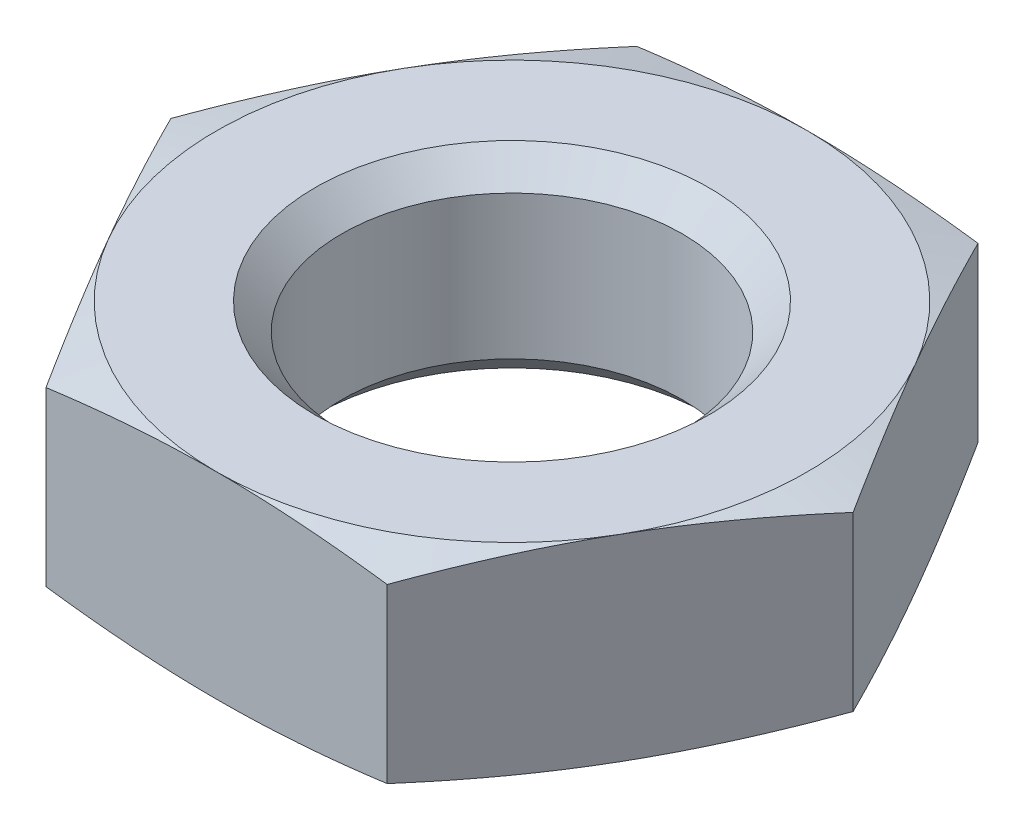
ISO-10303-21;
HEADER;
FILE_DESCRIPTION(('STEP AP214'),'2;1');
FILE_NAME('part.step','',(''),(''),'','','');
FILE_SCHEMA(('AUTOMOTIVE_DESIGN { 1 0 10303 214 1 1 1 1 }'));
ENDSEC;
DATA;
#1=APPLICATION_CONTEXT('core data for automotive mechanical design processes');
#2=APPLICATION_PROTOCOL_DEFINITION('international standard','automotive_design',2000,#1);
#3=PRODUCT_CONTEXT('',#1,'mechanical');
#4=PRODUCT('Part','Part','',(#3));
#5=PRODUCT_RELATED_PRODUCT_CATEGORY('part','',(#4));
#6=PRODUCT_DEFINITION_FORMATION('','',#4);
#7=PRODUCT_DEFINITION_CONTEXT('part definition',#1,'design');
#8=PRODUCT_DEFINITION('design','',#6,#7);
#9=PRODUCT_DEFINITION_SHAPE('','',#8);
#10=(LENGTH_UNIT() NAMED_UNIT(*) SI_UNIT(.MILLI.,.METRE.));
#11=(NAMED_UNIT(*) PLANE_ANGLE_UNIT() SI_UNIT($,.RADIAN.));
#12=(NAMED_UNIT(*) SI_UNIT($,.STERADIAN.) SOLID_ANGLE_UNIT());
#13=UNCERTAINTY_MEASURE_WITH_UNIT(LENGTH_MEASURE(1.E-05),#10,'distance_accuracy_value','');
#14=(GEOMETRIC_REPRESENTATION_CONTEXT(3) GLOBAL_UNCERTAINTY_ASSIGNED_CONTEXT((#13)) GLOBAL_UNIT_ASSIGNED_CONTEXT((#10,
#11,#12)) REPRESENTATION_CONTEXT('',''));
#15=CARTESIAN_POINT('',(0.,0.,0.));
#16=DIRECTION('',(0.,0.,1.));
#17=DIRECTION('',(1.,0.,0.));
#18=AXIS2_PLACEMENT_3D('',#15,#16,#17);
#19=CARTESIAN_POINT('',(0.,-1.75128869430069,0.));
#20=DIRECTION('',(0.,1.,0.));
#21=DIRECTION('',(0.86602540378444,0.,-0.499999999999997));
#22=AXIS2_PLACEMENT_3D('',#19,#20,#21);
#23=CONICAL_SURFACE('',#22,6.92820322928655,1.30899693899573);
#24=CARTESIAN_POINT('',(5.19615242270666,-2.,-2.99999999999999));
#25=CARTESIAN_POINT('',(4.61148005383153,-2.00000000008962,-4.01268224867338));
#26=CARTESIAN_POINT('',(4.04788436907825,-1.90771281177209,-4.98885860959265));
#27=CARTESIAN_POINT('',(3.46410161464002,-1.7512886942999,-6.00000000086218));
#28=B_SPLINE_CURVE_WITH_KNOTS('',3,(#24,#25,#26,#27),.UNSPECIFIED.,.F.,.F.,(4,4),(0.,1.),.UNSPECIFIED.);
#29=CARTESIAN_POINT('',(5.19615242270664,-2.,-2.99999999999998));
#30=VERTEX_POINT('',#29);
#31=CARTESIAN_POINT('',(3.46410161315304,-1.7512886942999,-6.));
#32=VERTEX_POINT('',#31);
#33=EDGE_CURVE('E109',#30,#32,#28,.T.);
#34=ORIENTED_EDGE('',*,*,#33,.F.);
#35=CARTESIAN_POINT('',(0.,-2.,0.));
#36=DIRECTION('',(0.,1.,0.));
#37=DIRECTION('',(0.86602540378444,0.,-0.499999999999997));
#38=AXIS2_PLACEMENT_3D('',#35,#36,#37);
#39=CIRCLE('',#38,6.);
#40=CARTESIAN_POINT('',(1.42589383300695E-06,-2.,-5.99999999999983));
#41=VERTEX_POINT('',#40);
#42=EDGE_CURVE('E127',#41,#30,#39,.F.);
#43=ORIENTED_EDGE('',*,*,#42,.F.);
#44=CARTESIAN_POINT('',(3.46410161315304,-1.7512886942999,-6.));
#45=CARTESIAN_POINT('',(2.30664031427027,-1.90635891012927,-6.));
#46=CARTESIAN_POINT('',(1.17741711711607,-1.99999970002092,-6.));
#47=CARTESIAN_POINT('',(1.42589383226102E-06,-2.,-6.));
#48=B_SPLINE_CURVE_WITH_KNOTS('',3,(#44,#45,#46,#47),.UNSPECIFIED.,.F.,.F.,(4,4),(0.,1.),.UNSPECIFIED.);
#49=EDGE_CURVE('E129',#32,#41,#48,.T.);
#50=ORIENTED_EDGE('',*,*,#49,.F.);
#51=EDGE_LOOP('',(#34,#43,#50));
#52=FACE_BOUND('',#51,.T.);
#53=ADVANCED_FACE('F17',(#52),#23,.T.);
#54=CARTESIAN_POINT('',(0.,-1.7512886940326,0.));
#55=DIRECTION('',(0.,1.,0.));
#56=DIRECTION('',(0.86602540378444,0.,0.499999999999997));
#57=AXIS2_PLACEMENT_3D('',#54,#55,#56);
#58=CONICAL_SURFACE('',#57,6.92820323028709,1.30899693899573);
#59=CARTESIAN_POINT('',(5.19615242270665,-2.,2.99999999999999));
#60=CARTESIAN_POINT('',(5.78082479141544,-2.00000000000048,1.98731775161471));
#61=CARTESIAN_POINT('',(6.34442047600676,-1.90771281159617,1.01114139097597));
#62=CARTESIAN_POINT('',(6.92820323027448,-1.7512886940326,1.75985173220132E-12));
#63=B_SPLINE_CURVE_WITH_KNOTS('',3,(#59,#60,#61,#62),.UNSPECIFIED.,.F.,.F.,(4,4),(0.,1.),.UNSPECIFIED.);
#64=CARTESIAN_POINT('',(5.19615242270664,-2.,2.99999999999998));
#65=VERTEX_POINT('',#64);
#66=CARTESIAN_POINT('',(6.92820323028072,-1.7512886940326,9.03987995570787E-12));
#67=VERTEX_POINT('',#66);
#68=EDGE_CURVE('E142',#65,#67,#63,.T.);
#69=ORIENTED_EDGE('',*,*,#68,.F.);
#70=CARTESIAN_POINT('',(0.,-2.,0.));
#71=DIRECTION('',(0.,1.,0.));
#72=DIRECTION('',(0.86602540378444,0.,0.499999999999997));
#73=AXIS2_PLACEMENT_3D('',#70,#71,#72);
#74=CIRCLE('',#73,6.);
#75=EDGE_CURVE('E119',#30,#65,#74,.F.);
#76=ORIENTED_EDGE('',*,*,#75,.F.);
#77=CARTESIAN_POINT('',(6.92820323028072,-1.7512886940326,9.03964403331514E-12));
#78=CARTESIAN_POINT('',(6.34442047601087,-1.90771281159617,-1.01114139096885));
#79=CARTESIAN_POINT('',(5.78082479141752,-2.00000000000048,-1.98731775161112));
#80=CARTESIAN_POINT('',(5.19615242270666,-2.,-2.99999999999999));
#81=B_SPLINE_CURVE_WITH_KNOTS('',3,(#77,#78,#79,#80),.UNSPECIFIED.,.F.,.F.,(4,4),(0.,1.),.UNSPECIFIED.);
#82=EDGE_CURVE('E105',#67,#30,#81,.T.);
#83=ORIENTED_EDGE('',*,*,#82,.F.);
#84=EDGE_LOOP('',(#69,#76,#83));
#85=FACE_BOUND('',#84,.T.);
#86=ADVANCED_FACE('F141',(#85),#58,.T.);
#87=CARTESIAN_POINT('',(0.,-1.75128869403115,0.));
#88=DIRECTION('',(0.,1.,0.));
#89=DIRECTION('',(9.50471779626236E-07,0.,-0.999999999999548));
#90=AXIS2_PLACEMENT_3D('',#87,#88,#89);
#91=CONICAL_SURFACE('',#90,6.9282032302925,1.30899693899573);
#92=CARTESIAN_POINT('',(1.42589383226102E-06,-2.,-6.));
#93=CARTESIAN_POINT('',(-1.16867236788489,-2.00000006217982,-6.));
#94=CARTESIAN_POINT('',(-2.29572568669476,-1.9078213792607,-6.));
#95=CARTESIAN_POINT('',(-3.4641016151347,-1.75128869403486,-6.));
#96=B_SPLINE_CURVE_WITH_KNOTS('',3,(#92,#93,#94,#95),.UNSPECIFIED.,.F.,.F.,(4,4),(0.,1.),.UNSPECIFIED.);
#97=CARTESIAN_POINT('',(-3.46410161513469,-1.75128869403486,-6.00000000000538));
#98=VERTEX_POINT('',#97);
#99=EDGE_CURVE('E118',#41,#98,#96,.T.);
#100=ORIENTED_EDGE('',*,*,#99,.F.);
#101=CARTESIAN_POINT('',(0.,-2.,0.));
#102=DIRECTION('',(0.,1.,0.));
#103=DIRECTION('',(2.3764897199204E-07,0.,-0.999999999999972));
#104=AXIS2_PLACEMENT_3D('',#101,#102,#103);
#105=CIRCLE('',#104,6.);
#106=CARTESIAN_POINT('',(-5.19615242270664,-2.,-2.99999999999999));
#107=VERTEX_POINT('',#106);
#108=EDGE_CURVE('E139',#107,#41,#105,.F.);
#109=ORIENTED_EDGE('',*,*,#108,.F.);
#110=CARTESIAN_POINT('',(-3.46410161513469,-1.75128869403486,-6.00000000000538));
#111=CARTESIAN_POINT('',(-4.04788436940382,-1.90771281159766,-4.98885860902873));
#112=CARTESIAN_POINT('',(-4.6114800539965,-2.00000000000123,-4.01268224838764));
#113=CARTESIAN_POINT('',(-5.19615242270665,-2.,-2.99999999999999));
#114=B_SPLINE_CURVE_WITH_KNOTS('',3,(#110,#111,#112,#113),.UNSPECIFIED.,.F.,.F.,(4,4),(0.,1.),.UNSPECIFIED.);
#115=EDGE_CURVE('E491',#98,#107,#114,.T.);
#116=ORIENTED_EDGE('',*,*,#115,.F.);
#117=EDGE_LOOP('',(#100,#109,#116));
#118=FACE_BOUND('',#117,.T.);
#119=ADVANCED_FACE('F166',(#118),#91,.T.);
#120=CARTESIAN_POINT('',(0.,-1.75128869403115,0.));
#121=DIRECTION('',(0.,1.,0.));
#122=DIRECTION('',(-9.50471779503771E-07,0.,0.999999999999548));
#123=AXIS2_PLACEMENT_3D('',#120,#121,#122);
#124=CONICAL_SURFACE('',#123,6.9282032302925,1.30899693899573);
#125=CARTESIAN_POINT('',(3.46410161513469,-1.75128869403486,6.00000000000538));
#126=CARTESIAN_POINT('',(4.04788436940382,-1.90771281159766,4.98885860902873));
#127=CARTESIAN_POINT('',(4.6114800539965,-2.00000000000123,4.01268224838763));
#128=CARTESIAN_POINT('',(5.19615242270665,-2.,2.99999999999999));
#129=B_SPLINE_CURVE_WITH_KNOTS('',3,(#125,#126,#127,#128),.UNSPECIFIED.,.F.,.F.,(4,4),(0.,1.),.UNSPECIFIED.);
#130=CARTESIAN_POINT('',(3.46410161513469,-1.75128869403486,6.00000000000538));
#131=VERTEX_POINT('',#130);
#132=EDGE_CURVE('E196',#131,#65,#129,.T.);
#133=ORIENTED_EDGE('',*,*,#132,.F.);
#134=CARTESIAN_POINT('',(-4.27730871598378E-06,-1.99999999999961,6.));
#135=CARTESIAN_POINT('',(1.16867053464082,-2.00000021211588,6.));
#136=CARTESIAN_POINT('',(2.29572473646542,-1.90782150656726,6.));
#137=CARTESIAN_POINT('',(3.4641016151347,-1.75128869403486,6.));
#138=B_SPLINE_CURVE_WITH_KNOTS('',3,(#134,#135,#136,#137),.UNSPECIFIED.,.F.,.F.,(4,4),(0.,1.),.UNSPECIFIED.);
#139=CARTESIAN_POINT('',(-4.27730871610449E-06,-2.,5.99999999999847));
#140=VERTEX_POINT('',#139);
#141=EDGE_CURVE('E206',#140,#131,#138,.T.);
#142=ORIENTED_EDGE('',*,*,#141,.F.);
#143=CARTESIAN_POINT('',(0.,-2.,0.));
#144=DIRECTION('',(0.,1.,0.));
#145=DIRECTION('',(-7.12884786017414E-07,0.,0.999999999999746));
#146=AXIS2_PLACEMENT_3D('',#143,#144,#145);
#147=CIRCLE('',#146,6.);
#148=EDGE_CURVE('E210',#65,#140,#147,.F.);
#149=ORIENTED_EDGE('',*,*,#148,.F.);
#150=EDGE_LOOP('',(#133,#142,#149));
#151=FACE_BOUND('',#150,.T.);
#152=ADVANCED_FACE('F172',(#151),#124,.T.);
#153=CARTESIAN_POINT('',(0.,-1.7512886940326,0.));
#154=DIRECTION('',(0.,1.,0.));
#155=DIRECTION('',(-0.86602540378444,0.,-0.499999999999998));
#156=AXIS2_PLACEMENT_3D('',#153,#154,#155);
#157=CONICAL_SURFACE('',#156,6.92820323028709,1.30899693899573);
#158=CARTESIAN_POINT('',(-5.19615242270665,-2.,-2.99999999999999));
#159=CARTESIAN_POINT('',(-5.78082479141544,-2.00000000000048,-1.98731775161472));
#160=CARTESIAN_POINT('',(-6.34442047600676,-1.90771281159617,-1.01114139097597));
#161=CARTESIAN_POINT('',(-6.92820323027448,-1.7512886940326,-1.76018057124868E-12));
#162=B_SPLINE_CURVE_WITH_KNOTS('',3,(#158,#159,#160,#161),.UNSPECIFIED.,.F.,.F.,(4,4),(0.,1.),.UNSPECIFIED.);
#163=CARTESIAN_POINT('',(-6.92820323027448,-1.7512886940326,-1.76018057124868E-12));
#164=VERTEX_POINT('',#163);
#165=EDGE_CURVE('E217',#107,#164,#162,.T.);
#166=ORIENTED_EDGE('',*,*,#165,.F.);
#167=CARTESIAN_POINT('',(0.,-2.,0.));
#168=DIRECTION('',(0.,1.,0.));
#169=DIRECTION('',(-0.86602540378444,0.,-0.499999999999998));
#170=AXIS2_PLACEMENT_3D('',#167,#168,#169);
#171=CIRCLE('',#170,6.);
#172=CARTESIAN_POINT('',(-5.19615242270665,-2.,2.99999999999997));
#173=VERTEX_POINT('',#172);
#174=EDGE_CURVE('E229',#173,#107,#171,.F.);
#175=ORIENTED_EDGE('',*,*,#174,.F.);
#176=CARTESIAN_POINT('',(-6.92820323028072,-1.7512886940326,-9.04051139505313E-12));
#177=CARTESIAN_POINT('',(-6.34442047601087,-1.90771281159616,1.01114139096885));
#178=CARTESIAN_POINT('',(-5.78082479141752,-2.00000000000048,1.98731775161112));
#179=CARTESIAN_POINT('',(-5.19615242270666,-2.,2.99999999999998));
#180=B_SPLINE_CURVE_WITH_KNOTS('',3,(#176,#177,#178,#179),.UNSPECIFIED.,.F.,.F.,(4,4),(0.,1.),.UNSPECIFIED.);
#181=EDGE_CURVE('E639',#164,#173,#180,.T.);
#182=ORIENTED_EDGE('',*,*,#181,.F.);
#183=EDGE_LOOP('',(#166,#175,#182));
#184=FACE_BOUND('',#183,.T.);
#185=ADVANCED_FACE('F231',(#184),#157,.T.);
#186=CARTESIAN_POINT('',(0.,1.75128869403342,0.));
#187=DIRECTION('',(0.,-1.,0.));
#188=DIRECTION('',(-0.86602540378444,0.,0.499999999999998));
#189=AXIS2_PLACEMENT_3D('',#186,#187,#188);
#190=CONICAL_SURFACE('',#189,6.92820323028412,1.30899693899576);
#191=CARTESIAN_POINT('',(-6.92820323028072,1.75128869403262,9.04125550804165E-12));
#192=CARTESIAN_POINT('',(-6.34442047601088,1.90771281159617,-1.01114139096883));
#193=CARTESIAN_POINT('',(-5.7808247914175,2.00000000000048,-1.98731775161114));
#194=CARTESIAN_POINT('',(-5.19615242270666,2.,-2.99999999999999));
#195=B_SPLINE_CURVE_WITH_KNOTS('',3,(#191,#192,#193,#194),.UNSPECIFIED.,.F.,.F.,(4,4),(0.,1.),.UNSPECIFIED.);
#196=CARTESIAN_POINT('',(-6.92820323028072,1.75128869403262,9.04125550804165E-12));
#197=VERTEX_POINT('',#196);
#198=CARTESIAN_POINT('',(-5.19615242270665,2.,-2.99999999999998));
#199=VERTEX_POINT('',#198);
#200=EDGE_CURVE('E260',#197,#199,#195,.T.);
#201=ORIENTED_EDGE('',*,*,#200,.F.);
#202=CARTESIAN_POINT('',(-5.19615242270666,2.,2.99999999999999));
#203=CARTESIAN_POINT('',(-5.78082479141542,2.00000000000048,1.98731775161475));
#204=CARTESIAN_POINT('',(-6.34442047600678,1.90771281159617,1.01114139097595));
#205=CARTESIAN_POINT('',(-6.92820323027448,1.75128869403263,1.76161168985445E-12));
#206=B_SPLINE_CURVE_WITH_KNOTS('',3,(#202,#203,#204,#205),.UNSPECIFIED.,.F.,.F.,(4,4),(0.,1.),.UNSPECIFIED.);
#207=CARTESIAN_POINT('',(-5.19615242270664,2.,2.99999999999999));
#208=VERTEX_POINT('',#207);
#209=EDGE_CURVE('E270',#208,#197,#206,.T.);
#210=ORIENTED_EDGE('',*,*,#209,.F.);
#211=CARTESIAN_POINT('',(0.,2.,0.));
#212=DIRECTION('',(0.,-1.,0.));
#213=DIRECTION('',(-0.86602540378444,0.,0.499999999999998));
#214=AXIS2_PLACEMENT_3D('',#211,#212,#213);
#215=CIRCLE('',#214,6.);
#216=EDGE_CURVE('E275',#208,#199,#215,.T.);
#217=ORIENTED_EDGE('',*,*,#216,.T.);
#218=EDGE_LOOP('',(#201,#210,#217));
#219=FACE_BOUND('',#218,.T.);
#220=ADVANCED_FACE('F240',(#219),#190,.T.);
#221=CARTESIAN_POINT('',(0.,1.75128869429992,0.));
#222=DIRECTION('',(0.,-1.,0.));
#223=DIRECTION('',(-0.866025403784441,0.,-0.499999999999996));
#224=AXIS2_PLACEMENT_3D('',#221,#222,#223);
#225=CONICAL_SURFACE('',#224,6.92820322928953,1.30899693899576);
#226=CARTESIAN_POINT('',(-5.19615242270666,2.,-2.99999999999999));
#227=CARTESIAN_POINT('',(-4.61148005383154,2.00000000008962,-4.01268224867336));
#228=CARTESIAN_POINT('',(-4.04788436907824,1.9077128117721,-4.98885860959267));
#229=CARTESIAN_POINT('',(-3.46410161464002,1.75128869429992,-6.00000000086219));
#230=B_SPLINE_CURVE_WITH_KNOTS('',3,(#226,#227,#228,#229),.UNSPECIFIED.,.F.,.F.,(4,4),(0.,1.),.UNSPECIFIED.);
#231=CARTESIAN_POINT('',(-3.46410161464002,1.75128869429992,-6.00000000086219));
#232=VERTEX_POINT('',#231);
#233=EDGE_CURVE('E282',#199,#232,#230,.T.);
#234=ORIENTED_EDGE('',*,*,#233,.F.);
#235=CARTESIAN_POINT('',(0.,2.,0.));
#236=DIRECTION('',(0.,-1.,0.));
#237=DIRECTION('',(-0.866025403784441,0.,-0.499999999999997));
#238=AXIS2_PLACEMENT_3D('',#235,#236,#237);
#239=CIRCLE('',#238,6.00000000000001);
#240=CARTESIAN_POINT('',(-1.42551435855509E-06,2.,-5.99999999999984));
#241=VERTEX_POINT('',#240);
#242=EDGE_CURVE('E294',#199,#241,#239,.T.);
#243=ORIENTED_EDGE('',*,*,#242,.T.);
#244=CARTESIAN_POINT('',(-3.46410161315304,1.75128869429992,-6.));
#245=CARTESIAN_POINT('',(-2.30664031414167,1.90635891012928,-6.));
#246=CARTESIAN_POINT('',(-1.17741711686402,1.99999970002091,-6.));
#247=CARTESIAN_POINT('',(-1.42551435933225E-06,2.,-6.));
#248=B_SPLINE_CURVE_WITH_KNOTS('',3,(#244,#245,#246,#247),.UNSPECIFIED.,.F.,.F.,(4,4),(0.,1.),.UNSPECIFIED.);
#249=EDGE_CURVE('E530',#232,#241,#248,.T.);
#250=ORIENTED_EDGE('',*,*,#249,.F.);
#251=EDGE_LOOP('',(#234,#243,#250));
#252=FACE_BOUND('',#251,.T.);
#253=ADVANCED_FACE('F296',(#252),#225,.T.);
#254=CARTESIAN_POINT('',(0.,1.75128869403489,0.));
#255=DIRECTION('',(0.,-1.,0.));
#256=DIRECTION('',(-2.37585726203802E-07,0.,-0.999999999999972));
#257=AXIS2_PLACEMENT_3D('',#254,#255,#256);
#258=CONICAL_SURFACE('',#257,6.92820323027864,1.30899693899576);
#259=CARTESIAN_POINT('',(-1.42551435933225E-06,2.,-6.));
#260=CARTESIAN_POINT('',(1.16867236812885,2.00000006215987,-6.));
#261=CARTESIAN_POINT('',(2.29572568682124,1.90782137924376,-6.));
#262=CARTESIAN_POINT('',(3.46410161513469,1.75128869403489,-6.));
#263=B_SPLINE_CURVE_WITH_KNOTS('',3,(#259,#260,#261,#262),.UNSPECIFIED.,.F.,.F.,(4,4),(0.,1.),.UNSPECIFIED.);
#264=CARTESIAN_POINT('',(3.46410161513469,1.75128869403489,-6.));
#265=VERTEX_POINT('',#264);
#266=EDGE_CURVE('E325',#241,#265,#263,.T.);
#267=ORIENTED_EDGE('',*,*,#266,.F.);
#268=CARTESIAN_POINT('',(0.,2.,0.));
#269=DIRECTION('',(0.,-1.,0.));
#270=DIRECTION('',(-2.37585726203802E-07,0.,-0.999999999999972));
#271=AXIS2_PLACEMENT_3D('',#268,#269,#270);
#272=CIRCLE('',#271,6.00000000000001);
#273=CARTESIAN_POINT('',(5.19615242270665,2.,-2.99999999999998));
#274=VERTEX_POINT('',#273);
#275=EDGE_CURVE('E329',#241,#274,#272,.T.);
#276=ORIENTED_EDGE('',*,*,#275,.T.);
#277=CARTESIAN_POINT('',(3.46410161513469,1.75128869403489,-6.00000000000538));
#278=CARTESIAN_POINT('',(4.04788436940383,1.90771281159767,-4.98885860902872));
#279=CARTESIAN_POINT('',(4.61148005399649,2.00000000000123,-4.01268224838765));
#280=CARTESIAN_POINT('',(5.19615242270666,2.,-2.99999999999999));
#281=B_SPLINE_CURVE_WITH_KNOTS('',3,(#277,#278,#279,#280),.UNSPECIFIED.,.F.,.F.,(4,4),(0.,1.),.UNSPECIFIED.);
#282=EDGE_CURVE('E336',#265,#274,#281,.T.);
#283=ORIENTED_EDGE('',*,*,#282,.F.);
#284=EDGE_LOOP('',(#267,#276,#283));
#285=FACE_BOUND('',#284,.T.);
#286=ADVANCED_FACE('F305',(#285),#258,.T.);
#287=CARTESIAN_POINT('',(0.,1.75128869403263,0.));
#288=DIRECTION('',(0.,-1.,0.));
#289=DIRECTION('',(0.86602540378444,0.,-0.499999999999997));
#290=AXIS2_PLACEMENT_3D('',#287,#288,#289);
#291=CONICAL_SURFACE('',#290,6.92820323028709,1.30899693899576);
#292=CARTESIAN_POINT('',(6.92820323028072,1.75128869403263,-9.04104630033291E-12));
#293=CARTESIAN_POINT('',(6.34442047601088,1.90771281159617,1.01114139096883));
#294=CARTESIAN_POINT('',(5.7808247914175,2.00000000000048,1.98731775161114));
#295=CARTESIAN_POINT('',(5.19615242270665,2.,2.99999999999999));
#296=B_SPLINE_CURVE_WITH_KNOTS('',3,(#292,#293,#294,#295),.UNSPECIFIED.,.F.,.F.,(4,4),(0.,1.),.UNSPECIFIED.);
#297=CARTESIAN_POINT('',(6.92820323027448,1.75128869403263,-1.76036962784565E-12));
#298=VERTEX_POINT('',#297);
#299=CARTESIAN_POINT('',(5.19615242270665,2.,2.99999999999998));
#300=VERTEX_POINT('',#299);
#301=EDGE_CURVE('E355',#298,#300,#296,.T.);
#302=ORIENTED_EDGE('',*,*,#301,.F.);
#303=CARTESIAN_POINT('',(5.19615242270666,2.,-2.99999999999999));
#304=CARTESIAN_POINT('',(5.78082479141542,2.00000000000048,-1.98731775161475));
#305=CARTESIAN_POINT('',(6.34442047600678,1.90771281159617,-1.01114139097594));
#306=CARTESIAN_POINT('',(6.92820323027448,1.75128869403263,-1.76074432811646E-12));
#307=B_SPLINE_CURVE_WITH_KNOTS('',3,(#303,#304,#305,#306),.UNSPECIFIED.,.F.,.F.,(4,4),(0.,1.),.UNSPECIFIED.);
#308=EDGE_CURVE('E384',#274,#298,#307,.T.);
#309=ORIENTED_EDGE('',*,*,#308,.F.);
#310=CARTESIAN_POINT('',(0.,2.,0.));
#311=DIRECTION('',(0.,-1.,0.));
#312=DIRECTION('',(0.86602540378444,0.,-0.499999999999997));
#313=AXIS2_PLACEMENT_3D('',#310,#311,#312);
#314=CIRCLE('',#313,6.00000000000001);
#315=EDGE_CURVE('E376',#274,#300,#314,.T.);
#316=ORIENTED_EDGE('',*,*,#315,.T.);
#317=EDGE_LOOP('',(#302,#309,#316));
#318=FACE_BOUND('',#317,.T.);
#319=ADVANCED_FACE('F360',(#318),#291,.T.);
#320=CARTESIAN_POINT('',(0.,1.75128869429992,0.));
#321=DIRECTION('',(0.,-1.,0.));
#322=DIRECTION('',(0.86602540378444,0.,0.499999999999997));
#323=AXIS2_PLACEMENT_3D('',#320,#321,#322);
#324=CONICAL_SURFACE('',#323,6.92820322928953,1.30899693899576);
#325=CARTESIAN_POINT('',(5.19615242270665,2.,2.99999999999999));
#326=CARTESIAN_POINT('',(4.61148005383153,2.00000000008962,4.01268224867337));
#327=CARTESIAN_POINT('',(4.04788436907824,1.90771281177211,4.98885860959266));
#328=CARTESIAN_POINT('',(3.46410161464002,1.75128869429992,6.00000000086218));
#329=B_SPLINE_CURVE_WITH_KNOTS('',3,(#325,#326,#327,#328),.UNSPECIFIED.,.F.,.F.,(4,4),(0.,1.),.UNSPECIFIED.);
#330=CARTESIAN_POINT('',(3.46410161464002,1.75128869429992,6.00000000086218));
#331=VERTEX_POINT('',#330);
#332=EDGE_CURVE('E383',#300,#331,#329,.T.);
#333=ORIENTED_EDGE('',*,*,#332,.F.);
#334=CARTESIAN_POINT('',(0.,2.,0.));
#335=DIRECTION('',(0.,-1.,0.));
#336=DIRECTION('',(0.86602540378444,0.,0.499999999999997));
#337=AXIS2_PLACEMENT_3D('',#334,#335,#336);
#338=CIRCLE('',#337,6.00000000000001);
#339=CARTESIAN_POINT('',(1.42540594094687E-06,2.,5.99999999999984));
#340=VERTEX_POINT('',#339);
#341=EDGE_CURVE('E396',#300,#340,#338,.T.);
#342=ORIENTED_EDGE('',*,*,#341,.T.);
#343=CARTESIAN_POINT('',(3.46410161315304,1.75128869429992,6.));
#344=CARTESIAN_POINT('',(2.30664031410494,1.90635891012928,6.));
#345=CARTESIAN_POINT('',(1.17741711679201,1.99999970002091,6.));
#346=CARTESIAN_POINT('',(1.42540594084972E-06,2.,6.));
#347=B_SPLINE_CURVE_WITH_KNOTS('',3,(#343,#344,#345,#346),.UNSPECIFIED.,.F.,.F.,(4,4),(0.,1.),.UNSPECIFIED.);
#348=EDGE_CURVE('E403',#331,#340,#347,.T.);
#349=ORIENTED_EDGE('',*,*,#348,.F.);
#350=EDGE_LOOP('',(#333,#342,#349));
#351=FACE_BOUND('',#350,.T.);
#352=ADVANCED_FACE('F369',(#351),#324,.T.);
#353=CARTESIAN_POINT('',(-6.,-2.,5.99999999999994));
#354=DIRECTION('',(0.,-1.,0.));
#355=DIRECTION('',(0.,0.,-1.));
#356=AXIS2_PLACEMENT_3D('',#353,#354,#355);
#357=PLANE('',#356);
#358=ORIENTED_EDGE('',*,*,#42,.T.);
#359=ORIENTED_EDGE('',*,*,#75,.T.);
#360=ORIENTED_EDGE('',*,*,#148,.T.);
#361=CARTESIAN_POINT('',(0.,-2.,0.));
#362=DIRECTION('',(0.,-1.,0.));
#363=DIRECTION('',(-7.12884786165393E-07,0.,0.999999999999746));
#364=AXIS2_PLACEMENT_3D('',#361,#362,#363);
#365=CIRCLE('',#364,6.);
#366=EDGE_CURVE('E411',#140,#173,#365,.T.);
#367=ORIENTED_EDGE('',*,*,#366,.T.);
#368=ORIENTED_EDGE('',*,*,#174,.T.);
#369=ORIENTED_EDGE('',*,*,#108,.T.);
#370=EDGE_LOOP('',(#358,#359,#360,#367,#368,#369));
#371=FACE_BOUND('',#370,.T.);
#372=CARTESIAN_POINT('',(0.,-2.,0.));
#373=DIRECTION('',(0.,1.,0.));
#374=DIRECTION('',(0.,0.,-1.));
#375=AXIS2_PLACEMENT_3D('',#372,#373,#374);
#376=CIRCLE('',#375,4.);
#377=CARTESIAN_POINT('',(0.,-2.,-4.));
#378=VERTEX_POINT('',#377);
#379=EDGE_CURVE('E419',#378,#378,#376,.F.);
#380=ORIENTED_EDGE('',*,*,#379,.F.);
#381=EDGE_LOOP('',(#380));
#382=FACE_BOUND('',#381,.T.);
#383=ADVANCED_FACE('F134',(#371,#382),#357,.T.);
#384=CARTESIAN_POINT('',(0.,-1.75128869430069,0.));
#385=DIRECTION('',(0.,1.,0.));
#386=DIRECTION('',(-0.866025403784442,0.,0.499999999999995));
#387=AXIS2_PLACEMENT_3D('',#384,#385,#386);
#388=CONICAL_SURFACE('',#387,6.92820322928655,1.30899693899573);
#389=CARTESIAN_POINT('',(-3.46410161315304,-1.7512886942999,6.));
#390=CARTESIAN_POINT('',(-2.30664128051911,-1.90635891012914,6.));
#391=CARTESIAN_POINT('',(-1.17741901106479,-1.99999970002066,6.));
#392=CARTESIAN_POINT('',(-4.27730871598378E-06,-1.99999999999961,6.));
#393=B_SPLINE_CURVE_WITH_KNOTS('',3,(#389,#390,#391,#392),.UNSPECIFIED.,.F.,.F.,(4,4),(0.,1.),.UNSPECIFIED.);
#394=CARTESIAN_POINT('',(-3.46410161315304,-1.7512886942999,6.));
#395=VERTEX_POINT('',#394);
#396=EDGE_CURVE('E424',#395,#140,#393,.T.);
#397=ORIENTED_EDGE('',*,*,#396,.F.);
#398=CARTESIAN_POINT('',(-5.19615242270666,-2.,2.99999999999998));
#399=CARTESIAN_POINT('',(-4.61148005383153,-2.00000000008962,4.01268224867337));
#400=CARTESIAN_POINT('',(-4.04788436907825,-1.90771281177209,4.98885860959266));
#401=CARTESIAN_POINT('',(-3.46410161464002,-1.7512886942999,6.00000000086219));
#402=B_SPLINE_CURVE_WITH_KNOTS('',3,(#398,#399,#400,#401),.UNSPECIFIED.,.F.,.F.,(4,4),(0.,1.),.UNSPECIFIED.);
#403=EDGE_CURVE('E37',#173,#395,#402,.T.);
#404=ORIENTED_EDGE('',*,*,#403,.F.);
#405=ORIENTED_EDGE('',*,*,#366,.F.);
#406=EDGE_LOOP('',(#397,#404,#405));
#407=FACE_BOUND('',#406,.T.);
#408=ADVANCED_FACE('F434',(#407),#388,.T.);
#409=CARTESIAN_POINT('',(0.,1.75128869403118,0.));
#410=DIRECTION('',(0.,-1.,0.));
#411=DIRECTION('',(9.50471779626236E-07,0.,0.999999999999548));
#412=AXIS2_PLACEMENT_3D('',#409,#410,#411);
#413=CONICAL_SURFACE('',#412,6.9282032302925,1.30899693899576);
#414=CARTESIAN_POINT('',(1.42540594084972E-06,2.,6.));
#415=CARTESIAN_POINT('',(-1.16867236819856,2.00000006215416,6.));
#416=CARTESIAN_POINT('',(-2.29572568685737,1.90782137923892,6.));
#417=CARTESIAN_POINT('',(-3.4641016151347,1.75128869403489,6.));
#418=B_SPLINE_CURVE_WITH_KNOTS('',3,(#414,#415,#416,#417),.UNSPECIFIED.,.F.,.F.,(4,4),(0.,1.),.UNSPECIFIED.);
#419=CARTESIAN_POINT('',(-3.4641016151347,1.75128869403489,6.));
#420=VERTEX_POINT('',#419);
#421=EDGE_CURVE('E460',#340,#420,#418,.T.);
#422=ORIENTED_EDGE('',*,*,#421,.F.);
#423=CARTESIAN_POINT('',(0.,2.,0.));
#424=DIRECTION('',(0.,-1.,0.));
#425=DIRECTION('',(2.37567656815226E-07,0.,0.999999999999972));
#426=AXIS2_PLACEMENT_3D('',#423,#424,#425);
#427=CIRCLE('',#426,6.00000000000001);
#428=EDGE_CURVE('E464',#340,#208,#427,.T.);
#429=ORIENTED_EDGE('',*,*,#428,.T.);
#430=CARTESIAN_POINT('',(-3.46410161513469,1.75128869403489,6.00000000000538));
#431=CARTESIAN_POINT('',(-4.04788436940382,1.90771281159767,4.98885860902873));
#432=CARTESIAN_POINT('',(-4.6114800539965,2.00000000000123,4.01268224838765));
#433=CARTESIAN_POINT('',(-5.19615242270666,2.,2.99999999999999));
#434=B_SPLINE_CURVE_WITH_KNOTS('',3,(#430,#431,#432,#433),.UNSPECIFIED.,.F.,.F.,(4,4),(0.,1.),.UNSPECIFIED.);
#435=EDGE_CURVE('E471',#420,#208,#434,.T.);
#436=ORIENTED_EDGE('',*,*,#435,.F.);
#437=EDGE_LOOP('',(#422,#429,#436));
#438=FACE_BOUND('',#437,.T.);
#439=ADVANCED_FACE('F443',(#438),#413,.T.);
#440=CARTESIAN_POINT('',(-6.00000000000001,2.,-5.99999999999986));
#441=DIRECTION('',(0.,1.,0.));
#442=DIRECTION('',(0.,0.,1.));
#443=AXIS2_PLACEMENT_3D('',#440,#441,#442);
#444=PLANE('',#443);
#445=ORIENTED_EDGE('',*,*,#315,.F.);
#446=ORIENTED_EDGE('',*,*,#275,.F.);
#447=ORIENTED_EDGE('',*,*,#242,.F.);
#448=ORIENTED_EDGE('',*,*,#216,.F.);
#449=ORIENTED_EDGE('',*,*,#428,.F.);
#450=ORIENTED_EDGE('',*,*,#341,.F.);
#451=EDGE_LOOP('',(#445,#446,#447,#448,#449,#450));
#452=FACE_BOUND('',#451,.T.);
#453=CARTESIAN_POINT('',(0.,2.,0.));
#454=DIRECTION('',(0.,-1.,0.));
#455=DIRECTION('',(-1.4205389953226E-07,0.,0.99999999999999));
#456=AXIS2_PLACEMENT_3D('',#453,#454,#455);
#457=CIRCLE('',#456,4.);
#458=CARTESIAN_POINT('',(-5.68215598129042E-07,2.,3.99999999999996));
#459=VERTEX_POINT('',#458);
#460=EDGE_CURVE('E478',#459,#459,#457,.T.);
#461=ORIENTED_EDGE('',*,*,#460,.T.);
#462=EDGE_LOOP('',(#461));
#463=FACE_BOUND('',#462,.T.);
#464=ADVANCED_FACE('F507',(#452,#463),#444,.T.);
#465=CARTESIAN_POINT('',(-6.92820323028072,-2.00000000000123,9.04125550804165E-12));
#466=DIRECTION('',(-0.866025403784442,0.,-0.499999999999994));
#467=DIRECTION('',(0.,1.,0.));
#468=AXIS2_PLACEMENT_3D('',#465,#466,#467);
#469=PLANE('',#468);
#470=ORIENTED_EDGE('',*,*,#115,.T.);
#471=ORIENTED_EDGE('',*,*,#165,.T.);
#472=DIRECTION('',(-1.78037484795138E-12,1.,3.08385365476732E-12));
#473=VECTOR('',#472,1.);
#474=CARTESIAN_POINT('',(-6.92820323027448,-1.7512886940326,-1.76018057124868E-12));
#475=LINE('',#474,#473);
#476=EDGE_CURVE('E486',#197,#164,#475,.F.);
#477=ORIENTED_EDGE('',*,*,#476,.F.);
#478=ORIENTED_EDGE('',*,*,#200,.T.);
#479=ORIENTED_EDGE('',*,*,#233,.T.);
#480=DIRECTION('',(-1.41232336435571E-10,-1.,2.44621627608584E-10));
#481=VECTOR('',#480,1.);
#482=CARTESIAN_POINT('',(-3.46410161464002,1.75128869429992,-6.00000000086219));
#483=LINE('',#482,#481);
#484=EDGE_CURVE('E528',#232,#98,#483,.T.);
#485=ORIENTED_EDGE('',*,*,#484,.T.);
#486=EDGE_LOOP('',(#470,#471,#477,#478,#479,#485));
#487=FACE_BOUND('',#486,.T.);
#488=ADVANCED_FACE('F497',(#487),#469,.T.);
#489=CARTESIAN_POINT('',(-3.4641016151378,-2.00000029763532,-6.));
#490=DIRECTION('',(0.,0.,-1.));
#491=DIRECTION('',(0.,1.,0.));
#492=AXIS2_PLACEMENT_3D('',#489,#490,#491);
#493=PLANE('',#492);
#494=ORIENTED_EDGE('',*,*,#49,.T.);
#495=ORIENTED_EDGE('',*,*,#99,.T.);
#496=ORIENTED_EDGE('',*,*,#484,.F.);
#497=ORIENTED_EDGE('',*,*,#249,.T.);
#498=ORIENTED_EDGE('',*,*,#266,.T.);
#499=DIRECTION('',(-5.65769704985364E-10,-1.,0.));
#500=VECTOR('',#499,1.);
#501=CARTESIAN_POINT('',(3.46410161513469,1.75128869403489,-6.));
#502=LINE('',#501,#500);
#503=EDGE_CURVE('E535',#265,#32,#502,.T.);
#504=ORIENTED_EDGE('',*,*,#503,.T.);
#505=EDGE_LOOP('',(#494,#495,#496,#497,#498,#504));
#506=FACE_BOUND('',#505,.T.);
#507=ADVANCED_FACE('F506',(#506),#493,.T.);
#508=CARTESIAN_POINT('',(3.46410161463842,-2.00000000008962,-6.00000000086495));
#509=DIRECTION('',(0.866025403784442,0.,-0.499999999999994));
#510=DIRECTION('',(0.,1.,0.));
#511=AXIS2_PLACEMENT_3D('',#508,#509,#510);
#512=PLANE('',#511);
#513=ORIENTED_EDGE('',*,*,#82,.T.);
#514=ORIENTED_EDGE('',*,*,#33,.T.);
#515=ORIENTED_EDGE('',*,*,#503,.F.);
#516=ORIENTED_EDGE('',*,*,#282,.T.);
#517=ORIENTED_EDGE('',*,*,#308,.T.);
#518=DIRECTION('',(1.78037484795138E-12,-1.,3.08351490543923E-12));
#519=VECTOR('',#518,1.);
#520=CARTESIAN_POINT('',(6.92820323027448,1.75128869403263,-1.76036962784565E-12));
#521=LINE('',#520,#519);
#522=EDGE_CURVE('E113',#298,#67,#521,.T.);
#523=ORIENTED_EDGE('',*,*,#522,.T.);
#524=EDGE_LOOP('',(#513,#514,#515,#516,#517,#523));
#525=FACE_BOUND('',#524,.T.);
#526=ADVANCED_FACE('F108',(#525),#512,.T.);
#527=CARTESIAN_POINT('',(6.92820323028072,-2.00000000000123,-9.04104630033291E-12));
#528=DIRECTION('',(0.866025403784442,0.,0.499999999999994));
#529=DIRECTION('',(0.,1.,0.));
#530=AXIS2_PLACEMENT_3D('',#527,#528,#529);
#531=PLANE('',#530);
#532=ORIENTED_EDGE('',*,*,#132,.T.);
#533=ORIENTED_EDGE('',*,*,#68,.T.);
#534=ORIENTED_EDGE('',*,*,#522,.F.);
#535=ORIENTED_EDGE('',*,*,#301,.T.);
#536=ORIENTED_EDGE('',*,*,#332,.T.);
#537=DIRECTION('',(1.41232336435571E-10,-1.,-2.44621374030055E-10));
#538=VECTOR('',#537,1.);
#539=CARTESIAN_POINT('',(3.46410161464002,1.75128869429992,6.00000000086218));
#540=LINE('',#539,#538);
#541=EDGE_CURVE('E549',#331,#131,#540,.T.);
#542=ORIENTED_EDGE('',*,*,#541,.T.);
#543=EDGE_LOOP('',(#532,#533,#534,#535,#536,#542));
#544=FACE_BOUND('',#543,.T.);
#545=ADVANCED_FACE('F582',(#544),#531,.T.);
#546=CARTESIAN_POINT('',(3.4641016151378,-2.00000029763532,6.));
#547=DIRECTION('',(0.,0.,1.));
#548=DIRECTION('',(0.,1.,0.));
#549=AXIS2_PLACEMENT_3D('',#546,#547,#548);
#550=PLANE('',#549);
#551=ORIENTED_EDGE('',*,*,#396,.T.);
#552=ORIENTED_EDGE('',*,*,#141,.T.);
#553=ORIENTED_EDGE('',*,*,#541,.F.);
#554=ORIENTED_EDGE('',*,*,#348,.T.);
#555=ORIENTED_EDGE('',*,*,#421,.T.);
#556=DIRECTION('',(5.6577021214242E-10,-1.,0.));
#557=VECTOR('',#556,1.);
#558=CARTESIAN_POINT('',(-3.4641016151347,1.75128869403489,6.));
#559=LINE('',#558,#557);
#560=EDGE_CURVE('E32',#420,#395,#559,.T.);
#561=ORIENTED_EDGE('',*,*,#560,.T.);
#562=EDGE_LOOP('',(#551,#552,#553,#554,#555,#561));
#563=FACE_BOUND('',#562,.T.);
#564=ADVANCED_FACE('F578',(#563),#550,.T.);
#565=CARTESIAN_POINT('',(-3.46410161464002,-2.00000000008962,6.00000000086219));
#566=DIRECTION('',(-0.866025403784442,0.,0.499999999999994));
#567=DIRECTION('',(0.,1.,0.));
#568=AXIS2_PLACEMENT_3D('',#565,#566,#567);
#569=PLANE('',#568);
#570=ORIENTED_EDGE('',*,*,#181,.T.);
#571=ORIENTED_EDGE('',*,*,#403,.T.);
#572=ORIENTED_EDGE('',*,*,#560,.F.);
#573=ORIENTED_EDGE('',*,*,#435,.T.);
#574=ORIENTED_EDGE('',*,*,#209,.T.);
#575=ORIENTED_EDGE('',*,*,#476,.T.);
#576=EDGE_LOOP('',(#570,#571,#572,#573,#574,#575));
#577=FACE_BOUND('',#576,.T.);
#578=ADVANCED_FACE('F603',(#577),#569,.T.);
#579=CARTESIAN_POINT('',(0.,2.,0.));
#580=DIRECTION('',(0.,1.,0.));
#581=DIRECTION('',(0.,0.,-1.));
#582=AXIS2_PLACEMENT_3D('',#579,#580,#581);
#583=CONICAL_SURFACE('',#582,4.,0.785398163397447);
#584=ORIENTED_EDGE('',*,*,#460,.F.);
#585=EDGE_LOOP('',(#584));
#586=FACE_BOUND('',#585,.T.);
#587=CARTESIAN_POINT('',(0.,1.4585,0.));
#588=DIRECTION('',(0.,-1.,0.));
#589=DIRECTION('',(0.,0.,1.));
#590=AXIS2_PLACEMENT_3D('',#587,#588,#589);
#591=CIRCLE('',#590,3.4585);
#592=CARTESIAN_POINT('',(0.,1.4585,3.4585));
#593=VERTEX_POINT('',#592);
#594=EDGE_CURVE('E25',#593,#593,#591,.T.);
#595=ORIENTED_EDGE('',*,*,#594,.T.);
#596=EDGE_LOOP('',(#595));
#597=FACE_BOUND('',#596,.T.);
#598=ADVANCED_FACE('F676',(#586,#597),#583,.F.);
#599=CARTESIAN_POINT('',(0.,-2.,0.));
#600=DIRECTION('',(0.,-1.,0.));
#601=DIRECTION('',(0.,0.,1.));
#602=AXIS2_PLACEMENT_3D('',#599,#600,#601);
#603=CYLINDRICAL_SURFACE('',#602,3.4585);
#604=CARTESIAN_POINT('',(0.,-1.4585,0.));
#605=DIRECTION('',(0.,-1.,0.));
#606=DIRECTION('',(-1.92329585250864E-10,0.,1.));
#607=AXIS2_PLACEMENT_3D('',#604,#605,#606);
#608=CIRCLE('',#607,3.4585);
#609=CARTESIAN_POINT('',(-6.65171870590113E-10,-1.4585,3.4585));
#610=VERTEX_POINT('',#609);
#611=EDGE_CURVE('E11',#610,#610,#608,.T.);
#612=ORIENTED_EDGE('',*,*,#611,.T.);
#613=EDGE_LOOP('',(#612));
#614=FACE_BOUND('',#613,.T.);
#615=ORIENTED_EDGE('',*,*,#594,.F.);
#616=EDGE_LOOP('',(#615));
#617=FACE_BOUND('',#616,.T.);
#618=ADVANCED_FACE('F678',(#614,#617),#603,.F.);
#619=CARTESIAN_POINT('',(0.,-2.,0.));
#620=DIRECTION('',(0.,-1.,0.));
#621=DIRECTION('',(1.42053899876766E-07,0.,0.99999999999999));
#622=AXIS2_PLACEMENT_3D('',#619,#620,#621);
#623=CONICAL_SURFACE('',#622,4.,0.785398163397449);
#624=ORIENTED_EDGE('',*,*,#379,.T.);
#625=EDGE_LOOP('',(#624));
#626=FACE_BOUND('',#625,.T.);
#627=ORIENTED_EDGE('',*,*,#611,.F.);
#628=EDGE_LOOP('',(#627));
#629=FACE_BOUND('',#628,.T.);
#630=ADVANCED_FACE('F19',(#626,#629),#623,.F.);
#631=CLOSED_SHELL('',(#53,#86,#119,#152,#185,#220,#253,#286,#319,#352,#383,#408,#439,#464,#488,
#507,#526,#545,#564,#578,#598,#618,#630));
#632=MANIFOLD_SOLID_BREP('B1',#631);
#633=ADVANCED_BREP_SHAPE_REPRESENTATION('',(#18,#632),#14);
#634=SHAPE_DEFINITION_REPRESENTATION(#9,#633);
ENDSEC;
END-ISO-10303-21;
